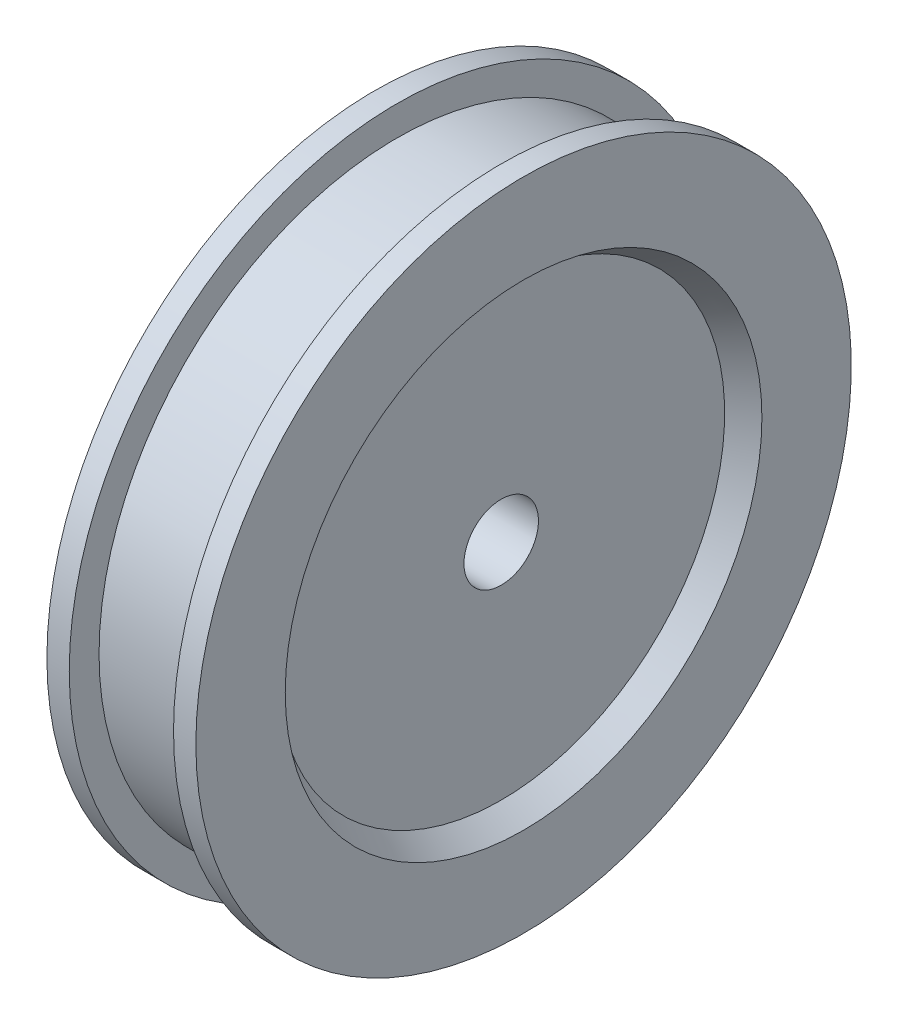
ISO-10303-21;
HEADER;
FILE_DESCRIPTION(('STEP AP214'),'2;1');
FILE_NAME('part.step','',(''),(''),'','','');
FILE_SCHEMA(('AUTOMOTIVE_DESIGN { 1 0 10303 214 1 1 1 1 }'));
ENDSEC;
DATA;
#1=APPLICATION_CONTEXT('core data for automotive mechanical design processes');
#2=APPLICATION_PROTOCOL_DEFINITION('international standard','automotive_design',2000,#1);
#3=PRODUCT_CONTEXT('',#1,'mechanical');
#4=PRODUCT('Part','Part','',(#3));
#5=PRODUCT_RELATED_PRODUCT_CATEGORY('part','',(#4));
#6=PRODUCT_DEFINITION_FORMATION('','',#4);
#7=PRODUCT_DEFINITION_CONTEXT('part definition',#1,'design');
#8=PRODUCT_DEFINITION('design','',#6,#7);
#9=PRODUCT_DEFINITION_SHAPE('','',#8);
#10=(LENGTH_UNIT() NAMED_UNIT(*) SI_UNIT(.MILLI.,.METRE.));
#11=(NAMED_UNIT(*) PLANE_ANGLE_UNIT() SI_UNIT($,.RADIAN.));
#12=(NAMED_UNIT(*) SI_UNIT($,.STERADIAN.) SOLID_ANGLE_UNIT());
#13=UNCERTAINTY_MEASURE_WITH_UNIT(LENGTH_MEASURE(1.E-05),#10,'distance_accuracy_value','');
#14=(GEOMETRIC_REPRESENTATION_CONTEXT(3) GLOBAL_UNCERTAINTY_ASSIGNED_CONTEXT((#13)) GLOBAL_UNIT_ASSIGNED_CONTEXT((#10,
#11,#12)) REPRESENTATION_CONTEXT('',''));
#15=CARTESIAN_POINT('',(0.,0.,0.));
#16=DIRECTION('',(0.,0.,1.));
#17=DIRECTION('',(1.,0.,0.));
#18=AXIS2_PLACEMENT_3D('',#15,#16,#17);
#19=CARTESIAN_POINT('',(7.,40.,0.));
#20=DIRECTION('',(1.,0.,0.));
#21=DIRECTION('',(0.,0.,-1.));
#22=AXIS2_PLACEMENT_3D('',#19,#20,#21);
#23=PLANE('',#22);
#24=CARTESIAN_POINT('',(7.,0.,0.));
#25=DIRECTION('',(-1.,0.,0.));
#26=DIRECTION('',(0.,0.,1.));
#27=AXIS2_PLACEMENT_3D('',#24,#25,#26);
#28=CIRCLE('',#27,40.);
#29=CARTESIAN_POINT('',(7.,0.,40.));
#30=VERTEX_POINT('',#29);
#31=EDGE_CURVE('E71',#30,#30,#28,.T.);
#32=ORIENTED_EDGE('',*,*,#31,.F.);
#33=EDGE_LOOP('',(#32));
#34=FACE_BOUND('',#33,.T.);
#35=CARTESIAN_POINT('',(7.,0.,0.));
#36=DIRECTION('',(-1.,0.,0.));
#37=DIRECTION('',(0.,0.,1.));
#38=AXIS2_PLACEMENT_3D('',#35,#36,#37);
#39=CIRCLE('',#38,44.);
#40=CARTESIAN_POINT('',(7.,0.,44.));
#41=VERTEX_POINT('',#40);
#42=EDGE_CURVE('E10',#41,#41,#39,.T.);
#43=ORIENTED_EDGE('',*,*,#42,.T.);
#44=EDGE_LOOP('',(#43));
#45=FACE_BOUND('',#44,.T.);
#46=ADVANCED_FACE('F31',(#34,#45),#23,.F.);
#47=CARTESIAN_POINT('',(0.,0.,0.));
#48=DIRECTION('',(-1.,0.,0.));
#49=DIRECTION('',(0.,0.,1.));
#50=AXIS2_PLACEMENT_3D('',#47,#48,#49);
#51=CYLINDRICAL_SURFACE('',#50,44.);
#52=ORIENTED_EDGE('',*,*,#42,.F.);
#53=EDGE_LOOP('',(#52));
#54=FACE_BOUND('',#53,.T.);
#55=CARTESIAN_POINT('',(10.,0.,0.));
#56=DIRECTION('',(-1.,0.,0.));
#57=DIRECTION('',(0.,0.,1.));
#58=AXIS2_PLACEMENT_3D('',#55,#56,#57);
#59=CIRCLE('',#58,44.);
#60=CARTESIAN_POINT('',(10.,0.,44.));
#61=VERTEX_POINT('',#60);
#62=EDGE_CURVE('E37',#61,#61,#59,.T.);
#63=ORIENTED_EDGE('',*,*,#62,.T.);
#64=EDGE_LOOP('',(#63));
#65=FACE_BOUND('',#64,.T.);
#66=ADVANCED_FACE('F78',(#54,#65),#51,.T.);
#67=CARTESIAN_POINT('',(10.,44.,0.));
#68=DIRECTION('',(-1.,0.,0.));
#69=DIRECTION('',(0.,0.,1.));
#70=AXIS2_PLACEMENT_3D('',#67,#68,#69);
#71=PLANE('',#70);
#72=ORIENTED_EDGE('',*,*,#62,.F.);
#73=EDGE_LOOP('',(#72));
#74=FACE_BOUND('',#73,.T.);
#75=CARTESIAN_POINT('',(10.,0.,0.));
#76=DIRECTION('',(-1.,0.,0.));
#77=DIRECTION('',(0.,0.,1.));
#78=AXIS2_PLACEMENT_3D('',#75,#76,#77);
#79=CIRCLE('',#78,32.);
#80=CARTESIAN_POINT('',(10.,0.,32.));
#81=VERTEX_POINT('',#80);
#82=EDGE_CURVE('E41',#81,#81,#79,.T.);
#83=ORIENTED_EDGE('',*,*,#82,.T.);
#84=EDGE_LOOP('',(#83));
#85=FACE_BOUND('',#84,.T.);
#86=ADVANCED_FACE('F82',(#74,#85),#71,.F.);
#87=CARTESIAN_POINT('',(7.,0.,0.));
#88=DIRECTION('',(1.,0.,0.));
#89=DIRECTION('',(0.,0.,-1.));
#90=AXIS2_PLACEMENT_3D('',#87,#88,#89);
#91=CONICAL_SURFACE('',#90,30.,0.588002603547568);
#92=ORIENTED_EDGE('',*,*,#82,.F.);
#93=EDGE_LOOP('',(#92));
#94=FACE_BOUND('',#93,.T.);
#95=CARTESIAN_POINT('',(7.,0.,0.));
#96=DIRECTION('',(-1.,0.,0.));
#97=DIRECTION('',(0.,0.,1.));
#98=AXIS2_PLACEMENT_3D('',#95,#96,#97);
#99=CIRCLE('',#98,30.);
#100=CARTESIAN_POINT('',(7.,0.,30.));
#101=VERTEX_POINT('',#100);
#102=EDGE_CURVE('E45',#101,#101,#99,.T.);
#103=ORIENTED_EDGE('',*,*,#102,.T.);
#104=EDGE_LOOP('',(#103));
#105=FACE_BOUND('',#104,.T.);
#106=ADVANCED_FACE('F87',(#94,#105),#91,.F.);
#107=CARTESIAN_POINT('',(7.,30.,0.));
#108=DIRECTION('',(-1.,0.,0.));
#109=DIRECTION('',(0.,0.,1.));
#110=AXIS2_PLACEMENT_3D('',#107,#108,#109);
#111=PLANE('',#110);
#112=ORIENTED_EDGE('',*,*,#102,.F.);
#113=EDGE_LOOP('',(#112));
#114=FACE_BOUND('',#113,.T.);
#115=CARTESIAN_POINT('',(7.,0.,0.));
#116=DIRECTION('',(-1.,0.,0.));
#117=DIRECTION('',(0.,0.,1.));
#118=AXIS2_PLACEMENT_3D('',#115,#116,#117);
#119=CIRCLE('',#118,5.);
#120=CARTESIAN_POINT('',(7.,0.,5.));
#121=VERTEX_POINT('',#120);
#122=EDGE_CURVE('E50',#121,#121,#119,.T.);
#123=ORIENTED_EDGE('',*,*,#122,.T.);
#124=EDGE_LOOP('',(#123));
#125=FACE_BOUND('',#124,.T.);
#126=ADVANCED_FACE('F93',(#114,#125),#111,.F.);
#127=CARTESIAN_POINT('',(0.,0.,0.));
#128=DIRECTION('',(-1.,0.,0.));
#129=DIRECTION('',(0.,0.,1.));
#130=AXIS2_PLACEMENT_3D('',#127,#128,#129);
#131=CYLINDRICAL_SURFACE('',#130,4.99999999999997);
#132=ORIENTED_EDGE('',*,*,#122,.F.);
#133=EDGE_LOOP('',(#132));
#134=FACE_BOUND('',#133,.T.);
#135=CARTESIAN_POINT('',(-7.00000000000004,0.,0.));
#136=DIRECTION('',(-1.,0.,0.));
#137=DIRECTION('',(0.,0.,1.));
#138=AXIS2_PLACEMENT_3D('',#135,#136,#137);
#139=CIRCLE('',#138,4.99999999999995);
#140=CARTESIAN_POINT('',(-7.00000000000004,0.,4.99999999999995));
#141=VERTEX_POINT('',#140);
#142=EDGE_CURVE('E53',#141,#141,#139,.T.);
#143=ORIENTED_EDGE('',*,*,#142,.T.);
#144=EDGE_LOOP('',(#143));
#145=FACE_BOUND('',#144,.T.);
#146=ADVANCED_FACE('F97',(#134,#145),#131,.F.);
#147=CARTESIAN_POINT('',(-7.00000000000012,30.,0.));
#148=DIRECTION('',(1.,0.,0.));
#149=DIRECTION('',(0.,0.,-1.));
#150=AXIS2_PLACEMENT_3D('',#147,#148,#149);
#151=PLANE('',#150);
#152=ORIENTED_EDGE('',*,*,#142,.F.);
#153=EDGE_LOOP('',(#152));
#154=FACE_BOUND('',#153,.T.);
#155=CARTESIAN_POINT('',(-7.00000000000021,0.,0.));
#156=DIRECTION('',(-1.,0.,0.));
#157=DIRECTION('',(0.,0.,1.));
#158=AXIS2_PLACEMENT_3D('',#155,#156,#157);
#159=CIRCLE('',#158,30.);
#160=CARTESIAN_POINT('',(-7.00000000000021,0.,30.));
#161=VERTEX_POINT('',#160);
#162=EDGE_CURVE('E56',#161,#161,#159,.T.);
#163=ORIENTED_EDGE('',*,*,#162,.T.);
#164=EDGE_LOOP('',(#163));
#165=FACE_BOUND('',#164,.T.);
#166=ADVANCED_FACE('F101',(#154,#165),#151,.F.);
#167=CARTESIAN_POINT('',(-10.0000000000002,0.,0.));
#168=DIRECTION('',(-1.,0.,0.));
#169=DIRECTION('',(0.,0.,1.));
#170=AXIS2_PLACEMENT_3D('',#167,#168,#169);
#171=CONICAL_SURFACE('',#170,31.9999999999999,0.588002603547561);
#172=ORIENTED_EDGE('',*,*,#162,.F.);
#173=EDGE_LOOP('',(#172));
#174=FACE_BOUND('',#173,.T.);
#175=CARTESIAN_POINT('',(-10.0000000000002,0.,0.));
#176=DIRECTION('',(-1.,0.,0.));
#177=DIRECTION('',(0.,0.,1.));
#178=AXIS2_PLACEMENT_3D('',#175,#176,#177);
#179=CIRCLE('',#178,31.9999999999999);
#180=CARTESIAN_POINT('',(-10.0000000000002,0.,31.9999999999999));
#181=VERTEX_POINT('',#180);
#182=EDGE_CURVE('E59',#181,#181,#179,.T.);
#183=ORIENTED_EDGE('',*,*,#182,.T.);
#184=EDGE_LOOP('',(#183));
#185=FACE_BOUND('',#184,.T.);
#186=ADVANCED_FACE('F105',(#174,#185),#171,.F.);
#187=CARTESIAN_POINT('',(-10.0000000000003,43.9999999999999,0.));
#188=DIRECTION('',(1.,0.,0.));
#189=DIRECTION('',(0.,0.,-1.));
#190=AXIS2_PLACEMENT_3D('',#187,#188,#189);
#191=PLANE('',#190);
#192=ORIENTED_EDGE('',*,*,#182,.F.);
#193=EDGE_LOOP('',(#192));
#194=FACE_BOUND('',#193,.T.);
#195=CARTESIAN_POINT('',(-10.0000000000003,0.,0.));
#196=DIRECTION('',(-1.,0.,0.));
#197=DIRECTION('',(0.,0.,1.));
#198=AXIS2_PLACEMENT_3D('',#195,#196,#197);
#199=CIRCLE('',#198,43.9999999999999);
#200=CARTESIAN_POINT('',(-10.0000000000003,0.,43.9999999999999));
#201=VERTEX_POINT('',#200);
#202=EDGE_CURVE('E62',#201,#201,#199,.T.);
#203=ORIENTED_EDGE('',*,*,#202,.T.);
#204=EDGE_LOOP('',(#203));
#205=FACE_BOUND('',#204,.T.);
#206=ADVANCED_FACE('F109',(#194,#205),#191,.F.);
#207=CARTESIAN_POINT('',(0.,0.,0.));
#208=DIRECTION('',(-1.,0.,0.));
#209=DIRECTION('',(0.,0.,1.));
#210=AXIS2_PLACEMENT_3D('',#207,#208,#209);
#211=CYLINDRICAL_SURFACE('',#210,44.);
#212=ORIENTED_EDGE('',*,*,#202,.F.);
#213=EDGE_LOOP('',(#212));
#214=FACE_BOUND('',#213,.T.);
#215=CARTESIAN_POINT('',(-7.00000000000031,0.,0.));
#216=DIRECTION('',(-1.,0.,0.));
#217=DIRECTION('',(0.,0.,1.));
#218=AXIS2_PLACEMENT_3D('',#215,#216,#217);
#219=CIRCLE('',#218,44.);
#220=CARTESIAN_POINT('',(-7.00000000000031,0.,44.));
#221=VERTEX_POINT('',#220);
#222=EDGE_CURVE('E65',#221,#221,#219,.T.);
#223=ORIENTED_EDGE('',*,*,#222,.T.);
#224=EDGE_LOOP('',(#223));
#225=FACE_BOUND('',#224,.T.);
#226=ADVANCED_FACE('F113',(#214,#225),#211,.T.);
#227=CARTESIAN_POINT('',(-7.00000000000029,39.9999999999999,0.));
#228=DIRECTION('',(-1.,0.,0.));
#229=DIRECTION('',(0.,0.,1.));
#230=AXIS2_PLACEMENT_3D('',#227,#228,#229);
#231=PLANE('',#230);
#232=ORIENTED_EDGE('',*,*,#222,.F.);
#233=EDGE_LOOP('',(#232));
#234=FACE_BOUND('',#233,.T.);
#235=CARTESIAN_POINT('',(-7.00000000000028,0.,0.));
#236=DIRECTION('',(-1.,0.,0.));
#237=DIRECTION('',(0.,0.,1.));
#238=AXIS2_PLACEMENT_3D('',#235,#236,#237);
#239=CIRCLE('',#238,39.9999999999999);
#240=CARTESIAN_POINT('',(-7.00000000000028,0.,39.9999999999999));
#241=VERTEX_POINT('',#240);
#242=EDGE_CURVE('E68',#241,#241,#239,.T.);
#243=ORIENTED_EDGE('',*,*,#242,.T.);
#244=EDGE_LOOP('',(#243));
#245=FACE_BOUND('',#244,.T.);
#246=ADVANCED_FACE('F117',(#234,#245),#231,.F.);
#247=CARTESIAN_POINT('',(0.,0.,0.));
#248=DIRECTION('',(-1.,0.,0.));
#249=DIRECTION('',(0.,0.,1.));
#250=AXIS2_PLACEMENT_3D('',#247,#248,#249);
#251=CYLINDRICAL_SURFACE('',#250,40.);
#252=ORIENTED_EDGE('',*,*,#242,.F.);
#253=EDGE_LOOP('',(#252));
#254=FACE_BOUND('',#253,.T.);
#255=ORIENTED_EDGE('',*,*,#31,.T.);
#256=EDGE_LOOP('',(#255));
#257=FACE_BOUND('',#256,.T.);
#258=ADVANCED_FACE('F75',(#254,#257),#251,.T.);
#259=CLOSED_SHELL('',(#46,#66,#86,#106,#126,#146,#166,#186,#206,#226,#246,#258));
#260=MANIFOLD_SOLID_BREP('B2',#259);
#261=ADVANCED_BREP_SHAPE_REPRESENTATION('',(#18,#260),#14);
#262=SHAPE_DEFINITION_REPRESENTATION(#9,#261);
ENDSEC;
END-ISO-10303-21;
